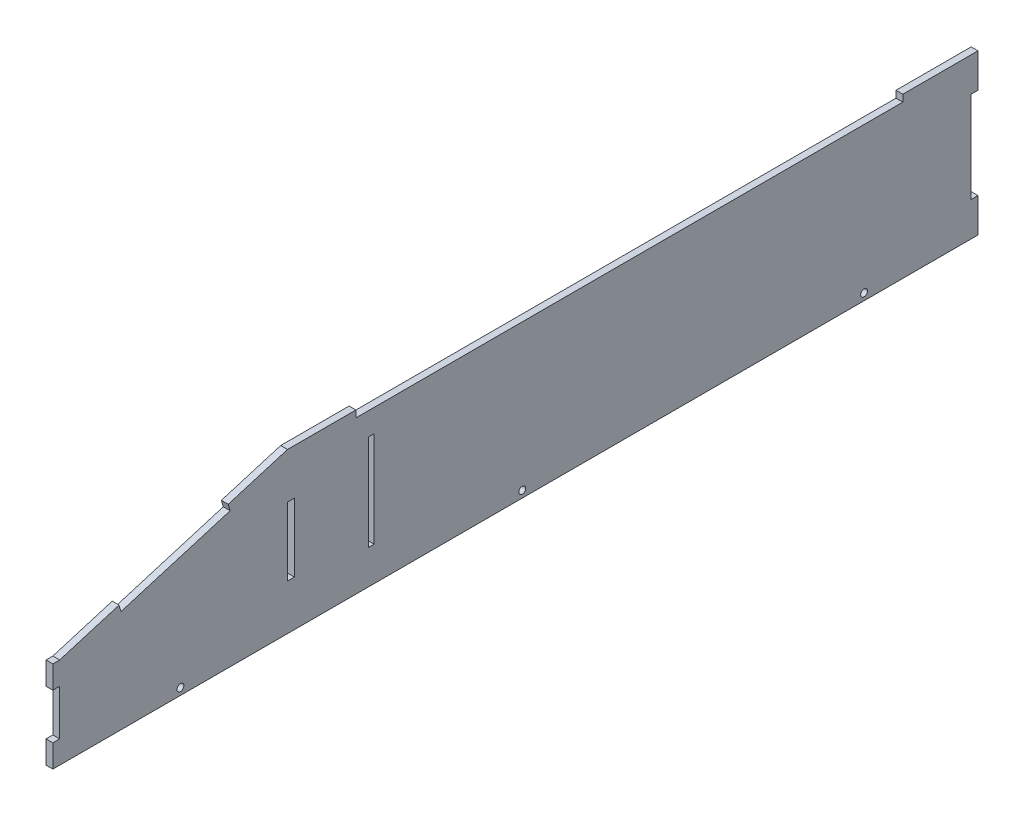
ISO-10303-21;
HEADER;
FILE_DESCRIPTION(('STEP AP214'),'2;1');
FILE_NAME('part.step','',(''),(''),'','','');
FILE_SCHEMA(('AUTOMOTIVE_DESIGN { 1 0 10303 214 1 1 1 1 }'));
ENDSEC;
DATA;
#1=APPLICATION_CONTEXT('core data for automotive mechanical design processes');
#2=APPLICATION_PROTOCOL_DEFINITION('international standard','automotive_design',2000,#1);
#3=PRODUCT_CONTEXT('',#1,'mechanical');
#4=PRODUCT('Part','Part','',(#3));
#5=PRODUCT_RELATED_PRODUCT_CATEGORY('part','',(#4));
#6=PRODUCT_DEFINITION_FORMATION('','',#4);
#7=PRODUCT_DEFINITION_CONTEXT('part definition',#1,'design');
#8=PRODUCT_DEFINITION('design','',#6,#7);
#9=PRODUCT_DEFINITION_SHAPE('','',#8);
#10=(LENGTH_UNIT() NAMED_UNIT(*) SI_UNIT(.MILLI.,.METRE.));
#11=(NAMED_UNIT(*) PLANE_ANGLE_UNIT() SI_UNIT($,.RADIAN.));
#12=(NAMED_UNIT(*) SI_UNIT($,.STERADIAN.) SOLID_ANGLE_UNIT());
#13=UNCERTAINTY_MEASURE_WITH_UNIT(LENGTH_MEASURE(1.E-05),#10,'distance_accuracy_value','');
#14=(GEOMETRIC_REPRESENTATION_CONTEXT(3) GLOBAL_UNCERTAINTY_ASSIGNED_CONTEXT((#13)) GLOBAL_UNIT_ASSIGNED_CONTEXT((#10,
#11,#12)) REPRESENTATION_CONTEXT('',''));
#15=CARTESIAN_POINT('',(0.,0.,0.));
#16=DIRECTION('',(0.,0.,1.));
#17=DIRECTION('',(1.,0.,0.));
#18=AXIS2_PLACEMENT_3D('',#15,#16,#17);
#19=CARTESIAN_POINT('',(3.,40.1738959397817,119.855679605587));
#20=DIRECTION('',(0.,0.,-1.));
#21=DIRECTION('',(-1.,0.,0.));
#22=AXIS2_PLACEMENT_3D('',#19,#20,#21);
#23=PLANE('',#22);
#24=DIRECTION('',(0.,-1.,0.));
#25=VECTOR('',#24,1.);
#26=CARTESIAN_POINT('',(3.,40.1738959397817,119.855679605587));
#27=LINE('',#26,#25);
#28=CARTESIAN_POINT('',(3.,10.1738959397816,119.855679605587));
#29=VERTEX_POINT('',#28);
#30=CARTESIAN_POINT('',(3.,0.173895939781652,119.855679605587));
#31=VERTEX_POINT('',#30);
#32=EDGE_CURVE('E418',#29,#31,#27,.T.);
#33=ORIENTED_EDGE('',*,*,#32,.F.);
#34=DIRECTION('',(-1.,0.,0.));
#35=VECTOR('',#34,1.);
#36=CARTESIAN_POINT('',(518.001516988057,10.1738959397816,119.855679605587));
#37=LINE('',#36,#35);
#38=CARTESIAN_POINT('',(0.,10.1738959397816,119.855679605587));
#39=VERTEX_POINT('',#38);
#40=EDGE_CURVE('E313',#29,#39,#37,.T.);
#41=ORIENTED_EDGE('',*,*,#40,.T.);
#42=DIRECTION('',(0.,-1.,0.));
#43=VECTOR('',#42,1.);
#44=CARTESIAN_POINT('',(0.,40.1738959397817,119.855679605587));
#45=LINE('',#44,#43);
#46=CARTESIAN_POINT('',(0.,0.173895939781652,119.855679605587));
#47=VERTEX_POINT('',#46);
#48=EDGE_CURVE('E439',#39,#47,#45,.T.);
#49=ORIENTED_EDGE('',*,*,#48,.T.);
#50=DIRECTION('',(-1.,0.,0.));
#51=VECTOR('',#50,1.);
#52=CARTESIAN_POINT('',(3.,0.173895939781652,119.855679605587));
#53=LINE('',#52,#51);
#54=EDGE_CURVE('E422',#31,#47,#53,.T.);
#55=ORIENTED_EDGE('',*,*,#54,.F.);
#56=EDGE_LOOP('',(#33,#41,#49,#55));
#57=FACE_BOUND('',#56,.T.);
#58=ADVANCED_FACE('F33',(#57),#23,.F.);
#59=CARTESIAN_POINT('',(3.,40.1738959397817,116.855679605587));
#60=DIRECTION('',(0.,-0.957826285221152,-0.287347885566345));
#61=DIRECTION('',(0.,0.287347885566345,-0.957826285221152));
#62=AXIS2_PLACEMENT_3D('',#59,#60,#61);
#63=PLANE('',#62);
#64=DIRECTION('',(0.,-0.287347885566345,0.957826285221151));
#65=VECTOR('',#64,1.);
#66=CARTESIAN_POINT('',(3.,40.1738959397817,116.855679605587));
#67=LINE('',#66,#65);
#68=CARTESIAN_POINT('',(3.,47.9906391740598,90.7998688246599));
#69=VERTEX_POINT('',#68);
#70=CARTESIAN_POINT('',(3.,40.1738959397817,116.855679605587));
#71=VERTEX_POINT('',#70);
#72=EDGE_CURVE('E412',#69,#71,#67,.T.);
#73=ORIENTED_EDGE('',*,*,#72,.F.);
#74=DIRECTION('',(-1.,0.,0.));
#75=VECTOR('',#74,1.);
#76=CARTESIAN_POINT('',(518.001516988057,47.9906391740598,90.7998688246599));
#77=LINE('',#76,#75);
#78=CARTESIAN_POINT('',(0.,47.9906391740598,90.7998688246599));
#79=VERTEX_POINT('',#78);
#80=EDGE_CURVE('E340',#69,#79,#77,.T.);
#81=ORIENTED_EDGE('',*,*,#80,.T.);
#82=DIRECTION('',(0.,-0.287347885566345,0.957826285221151));
#83=VECTOR('',#82,1.);
#84=CARTESIAN_POINT('',(0.,40.1738959397817,116.855679605587));
#85=LINE('',#84,#83);
#86=CARTESIAN_POINT('',(0.,40.1738959397817,116.855679605587));
#87=VERTEX_POINT('',#86);
#88=EDGE_CURVE('E433',#79,#87,#85,.T.);
#89=ORIENTED_EDGE('',*,*,#88,.T.);
#90=DIRECTION('',(-1.,0.,0.));
#91=VECTOR('',#90,1.);
#92=CARTESIAN_POINT('',(3.,40.1738959397817,116.855679605587));
#93=LINE('',#92,#91);
#94=EDGE_CURVE('E447',#71,#87,#93,.T.);
#95=ORIENTED_EDGE('',*,*,#94,.F.);
#96=EDGE_LOOP('',(#73,#81,#89,#95));
#97=FACE_BOUND('',#96,.T.);
#98=ADVANCED_FACE('F585',(#97),#63,.F.);
#99=CARTESIAN_POINT('',(3.,70.1738959397817,16.855679605587));
#100=DIRECTION('',(0.,-1.,0.));
#101=DIRECTION('',(0.,0.,-1.));
#102=AXIS2_PLACEMENT_3D('',#99,#100,#101);
#103=PLANE('',#102);
#104=DIRECTION('',(0.,0.,1.));
#105=VECTOR('',#104,1.);
#106=CARTESIAN_POINT('',(3.,70.1738959397817,16.855679605587));
#107=LINE('',#106,#105);
#108=CARTESIAN_POINT('',(3.,70.1738959397817,-13.144320394413));
#109=VERTEX_POINT('',#108);
#110=CARTESIAN_POINT('',(3.,70.1738959397817,16.855679605587));
#111=VERTEX_POINT('',#110);
#112=EDGE_CURVE('E408',#109,#111,#107,.T.);
#113=ORIENTED_EDGE('',*,*,#112,.F.);
#114=DIRECTION('',(-1.,0.,0.));
#115=VECTOR('',#114,1.);
#116=CARTESIAN_POINT('',(518.001516988057,70.1738959397817,-13.144320394413));
#117=LINE('',#116,#115);
#118=CARTESIAN_POINT('',(0.,70.1738959397817,-13.144320394413));
#119=VERTEX_POINT('',#118);
#120=EDGE_CURVE('E367',#109,#119,#117,.T.);
#121=ORIENTED_EDGE('',*,*,#120,.T.);
#122=DIRECTION('',(0.,0.,1.));
#123=VECTOR('',#122,1.);
#124=CARTESIAN_POINT('',(0.,70.1738959397817,16.855679605587));
#125=LINE('',#124,#123);
#126=CARTESIAN_POINT('',(0.,70.1738959397817,16.855679605587));
#127=VERTEX_POINT('',#126);
#128=EDGE_CURVE('E429',#119,#127,#125,.T.);
#129=ORIENTED_EDGE('',*,*,#128,.T.);
#130=DIRECTION('',(-1.,0.,0.));
#131=VECTOR('',#130,1.);
#132=CARTESIAN_POINT('',(3.,70.1738959397817,16.855679605587));
#133=LINE('',#132,#131);
#134=EDGE_CURVE('E450',#111,#127,#133,.T.);
#135=ORIENTED_EDGE('',*,*,#134,.F.);
#136=EDGE_LOOP('',(#113,#121,#129,#135));
#137=FACE_BOUND('',#136,.T.);
#138=ADVANCED_FACE('F567',(#137),#103,.F.);
#139=CARTESIAN_POINT('',(3.,0.173895939781676,-286.144320394413));
#140=DIRECTION('',(0.,0.,1.));
#141=DIRECTION('',(1.,0.,0.));
#142=AXIS2_PLACEMENT_3D('',#139,#140,#141);
#143=PLANE('',#142);
#144=DIRECTION('',(-1.,0.,0.));
#145=VECTOR('',#144,1.);
#146=CARTESIAN_POINT('',(521.751516988057,15.1738959397817,-286.144320394413));
#147=LINE('',#146,#145);
#148=CARTESIAN_POINT('',(3.,15.1738959397817,-286.144320394413));
#149=VERTEX_POINT('',#148);
#150=CARTESIAN_POINT('',(0.,15.1738959397817,-286.144320394413));
#151=VERTEX_POINT('',#150);
#152=EDGE_CURVE('E394',#149,#151,#147,.T.);
#153=ORIENTED_EDGE('',*,*,#152,.F.);
#154=DIRECTION('',(0.,1.,0.));
#155=VECTOR('',#154,1.);
#156=CARTESIAN_POINT('',(3.,0.173895939781676,-286.144320394413));
#157=LINE('',#156,#155);
#158=CARTESIAN_POINT('',(3.,0.173895939781676,-286.144320394413));
#159=VERTEX_POINT('',#158);
#160=EDGE_CURVE('E405',#159,#149,#157,.T.);
#161=ORIENTED_EDGE('',*,*,#160,.F.);
#162=DIRECTION('',(-1.,0.,0.));
#163=VECTOR('',#162,1.);
#164=CARTESIAN_POINT('',(3.,0.173895939781676,-286.144320394413));
#165=LINE('',#164,#163);
#166=CARTESIAN_POINT('',(0.,0.173895939781676,-286.144320394413));
#167=VERTEX_POINT('',#166);
#168=EDGE_CURVE('E456',#159,#167,#165,.T.);
#169=ORIENTED_EDGE('',*,*,#168,.T.);
#170=DIRECTION('',(0.,1.,0.));
#171=VECTOR('',#170,1.);
#172=CARTESIAN_POINT('',(0.,0.173895939781676,-286.144320394413));
#173=LINE('',#172,#171);
#174=EDGE_CURVE('E426',#167,#151,#173,.T.);
#175=ORIENTED_EDGE('',*,*,#174,.T.);
#176=EDGE_LOOP('',(#153,#161,#169,#175));
#177=FACE_BOUND('',#176,.T.);
#178=ADVANCED_FACE('F535',(#177),#143,.F.);
#179=DIRECTION('',(-1.,0.,0.));
#180=VECTOR('',#179,1.);
#181=CARTESIAN_POINT('',(521.751516988057,55.1738959397817,-286.144320394413));
#182=LINE('',#181,#180);
#183=CARTESIAN_POINT('',(3.,55.1738959397817,-286.144320394413));
#184=VERTEX_POINT('',#183);
#185=CARTESIAN_POINT('',(0.,55.1738959397817,-286.144320394413));
#186=VERTEX_POINT('',#185);
#187=EDGE_CURVE('E388',#184,#186,#182,.T.);
#188=ORIENTED_EDGE('',*,*,#187,.T.);
#189=CARTESIAN_POINT('',(0.,70.1738959397817,-286.144320394413));
#190=VERTEX_POINT('',#189);
#191=EDGE_CURVE('E425',#186,#190,#173,.T.);
#192=ORIENTED_EDGE('',*,*,#191,.T.);
#193=DIRECTION('',(-1.,0.,0.));
#194=VECTOR('',#193,1.);
#195=CARTESIAN_POINT('',(3.,70.1738959397817,-286.144320394413));
#196=LINE('',#195,#194);
#197=CARTESIAN_POINT('',(3.,70.1738959397817,-286.144320394413));
#198=VERTEX_POINT('',#197);
#199=EDGE_CURVE('E453',#198,#190,#196,.T.);
#200=ORIENTED_EDGE('',*,*,#199,.F.);
#201=EDGE_CURVE('E403',#184,#198,#157,.T.);
#202=ORIENTED_EDGE('',*,*,#201,.F.);
#203=EDGE_LOOP('',(#188,#192,#200,#202));
#204=FACE_BOUND('',#203,.T.);
#205=ADVANCED_FACE('F489',(#204),#143,.F.);
#206=CARTESIAN_POINT('',(3.,0.,0.));
#207=DIRECTION('',(1.,0.,0.));
#208=DIRECTION('',(0.,0.,-1.));
#209=AXIS2_PLACEMENT_3D('',#206,#207,#208);
#210=PLANE('',#209);
#211=CARTESIAN_POINT('',(3.,3.17389593977956,63.855679605587));
#212=DIRECTION('',(1.,0.,0.));
#213=DIRECTION('',(0.,0.,-1.));
#214=AXIS2_PLACEMENT_3D('',#211,#212,#213);
#215=CIRCLE('',#214,1.50000000000003);
#216=CARTESIAN_POINT('',(3.,3.17389593977956,62.3556796055869));
#217=VERTEX_POINT('',#216);
#218=EDGE_CURVE('E479',#217,#217,#215,.T.);
#219=ORIENTED_EDGE('',*,*,#218,.F.);
#220=EDGE_LOOP('',(#219));
#221=FACE_BOUND('',#220,.T.);
#222=CARTESIAN_POINT('',(3.,3.1738959397806,-86.144320394413));
#223=DIRECTION('',(1.,0.,0.));
#224=DIRECTION('',(0.,0.,-1.));
#225=AXIS2_PLACEMENT_3D('',#222,#223,#224);
#226=CIRCLE('',#225,1.50000000000003);
#227=CARTESIAN_POINT('',(3.,3.1738959397806,-87.6443203944131));
#228=VERTEX_POINT('',#227);
#229=EDGE_CURVE('E469',#228,#228,#226,.T.);
#230=ORIENTED_EDGE('',*,*,#229,.F.);
#231=EDGE_LOOP('',(#230));
#232=FACE_BOUND('',#231,.T.);
#233=CARTESIAN_POINT('',(3.,3.17389593978165,-236.144320394413));
#234=DIRECTION('',(1.,0.,0.));
#235=DIRECTION('',(0.,0.,-1.));
#236=AXIS2_PLACEMENT_3D('',#233,#234,#235);
#237=CIRCLE('',#236,1.50000000000003);
#238=CARTESIAN_POINT('',(3.,3.17389593978165,-237.644320394413));
#239=VERTEX_POINT('',#238);
#240=EDGE_CURVE('E466',#239,#239,#237,.T.);
#241=ORIENTED_EDGE('',*,*,#240,.F.);
#242=EDGE_LOOP('',(#241));
#243=FACE_BOUND('',#242,.T.);
#244=DIRECTION('',(0.,1.,0.));
#245=VECTOR('',#244,1.);
#246=CARTESIAN_POINT('',(3.,57.1738959397817,-21.144320394413));
#247=LINE('',#246,#245);
#248=CARTESIAN_POINT('',(3.,15.1738959397817,-21.144320394413));
#249=VERTEX_POINT('',#248);
#250=CARTESIAN_POINT('',(3.,57.1738959397817,-21.144320394413));
#251=VERTEX_POINT('',#250);
#252=EDGE_CURVE('E50',#249,#251,#247,.T.);
#253=ORIENTED_EDGE('',*,*,#252,.F.);
#254=DIRECTION('',(0.,0.,-1.));
#255=VECTOR('',#254,1.);
#256=CARTESIAN_POINT('',(3.,15.1738959397817,-21.144320394413));
#257=LINE('',#256,#255);
#258=CARTESIAN_POINT('',(3.,15.1738959397817,-18.644320394413));
#259=VERTEX_POINT('',#258);
#260=EDGE_CURVE('E251',#259,#249,#257,.T.);
#261=ORIENTED_EDGE('',*,*,#260,.F.);
#262=DIRECTION('',(0.,-1.,0.));
#263=VECTOR('',#262,1.);
#264=CARTESIAN_POINT('',(3.,57.1738959397817,-18.644320394413));
#265=LINE('',#264,#263);
#266=CARTESIAN_POINT('',(3.,57.1738959397817,-18.644320394413));
#267=VERTEX_POINT('',#266);
#268=EDGE_CURVE('E235',#267,#259,#265,.T.);
#269=ORIENTED_EDGE('',*,*,#268,.F.);
#270=DIRECTION('',(0.,0.,1.));
#271=VECTOR('',#270,1.);
#272=CARTESIAN_POINT('',(3.,57.1738959397817,-21.144320394413));
#273=LINE('',#272,#271);
#274=EDGE_CURVE('E244',#251,#267,#273,.T.);
#275=ORIENTED_EDGE('',*,*,#274,.F.);
#276=EDGE_LOOP('',(#253,#261,#269,#275));
#277=FACE_BOUND('',#276,.T.);
#278=DIRECTION('',(0.,0.,1.));
#279=VECTOR('',#278,1.);
#280=CARTESIAN_POINT('',(3.,50.1738959397817,13.855679605587));
#281=LINE('',#280,#279);
#282=CARTESIAN_POINT('',(3.,50.1738959397817,13.855679605587));
#283=VERTEX_POINT('',#282);
#284=CARTESIAN_POINT('',(3.,50.1738959397817,16.855679605587));
#285=VERTEX_POINT('',#284);
#286=EDGE_CURVE('E258',#283,#285,#281,.T.);
#287=ORIENTED_EDGE('',*,*,#286,.F.);
#288=DIRECTION('',(0.,1.,0.));
#289=VECTOR('',#288,1.);
#290=CARTESIAN_POINT('',(3.,20.1738959397817,13.855679605587));
#291=LINE('',#290,#289);
#292=CARTESIAN_POINT('',(3.,20.1738959397817,13.855679605587));
#293=VERTEX_POINT('',#292);
#294=EDGE_CURVE('E265',#293,#283,#291,.T.);
#295=ORIENTED_EDGE('',*,*,#294,.F.);
#296=DIRECTION('',(0.,0.,-1.));
#297=VECTOR('',#296,1.);
#298=CARTESIAN_POINT('',(3.,20.1738959397817,16.855679605587));
#299=LINE('',#298,#297);
#300=CARTESIAN_POINT('',(3.,20.1738959397817,16.855679605587));
#301=VERTEX_POINT('',#300);
#302=EDGE_CURVE('E279',#301,#293,#299,.T.);
#303=ORIENTED_EDGE('',*,*,#302,.F.);
#304=DIRECTION('',(0.,-1.,0.));
#305=VECTOR('',#304,1.);
#306=CARTESIAN_POINT('',(3.,50.1738959397817,16.855679605587));
#307=LINE('',#306,#305);
#308=EDGE_CURVE('E276',#285,#301,#307,.T.);
#309=ORIENTED_EDGE('',*,*,#308,.F.);
#310=EDGE_LOOP('',(#287,#295,#303,#309));
#311=FACE_BOUND('',#310,.T.);
#312=DIRECTION('',(0.,0.,1.));
#313=VECTOR('',#312,1.);
#314=CARTESIAN_POINT('',(3.,10.1738959397816,116.855679605587));
#315=LINE('',#314,#313);
#316=CARTESIAN_POINT('',(3.,10.1738959397816,116.855679605587));
#317=VERTEX_POINT('',#316);
#318=EDGE_CURVE('E296',#317,#29,#315,.T.);
#319=ORIENTED_EDGE('',*,*,#318,.T.);
#320=ORIENTED_EDGE('',*,*,#32,.T.);
#321=DIRECTION('',(0.,0.,-1.));
#322=VECTOR('',#321,1.);
#323=CARTESIAN_POINT('',(3.,0.173895939781652,119.855679605587));
#324=LINE('',#323,#322);
#325=EDGE_CURVE('E400',#31,#159,#324,.T.);
#326=ORIENTED_EDGE('',*,*,#325,.T.);
#327=ORIENTED_EDGE('',*,*,#160,.T.);
#328=DIRECTION('',(0.,0.,-1.));
#329=VECTOR('',#328,1.);
#330=CARTESIAN_POINT('',(3.,15.1738959397817,-283.144320394413));
#331=LINE('',#330,#329);
#332=CARTESIAN_POINT('',(3.,15.1738959397817,-283.144320394413));
#333=VERTEX_POINT('',#332);
#334=EDGE_CURVE('E377',#333,#149,#331,.T.);
#335=ORIENTED_EDGE('',*,*,#334,.F.);
#336=DIRECTION('',(0.,-1.,0.));
#337=VECTOR('',#336,1.);
#338=CARTESIAN_POINT('',(3.,55.1738959397817,-283.144320394413));
#339=LINE('',#338,#337);
#340=CARTESIAN_POINT('',(3.,55.1738959397817,-283.144320394413));
#341=VERTEX_POINT('',#340);
#342=EDGE_CURVE('E374',#341,#333,#339,.T.);
#343=ORIENTED_EDGE('',*,*,#342,.F.);
#344=DIRECTION('',(0.,0.,1.));
#345=VECTOR('',#344,1.);
#346=CARTESIAN_POINT('',(3.,55.1738959397817,-286.144320394413));
#347=LINE('',#346,#345);
#348=EDGE_CURVE('E376',#184,#341,#347,.T.);
#349=ORIENTED_EDGE('',*,*,#348,.F.);
#350=ORIENTED_EDGE('',*,*,#201,.T.);
#351=CARTESIAN_POINT('',(3.,70.1738959397817,-253.144320394413));
#352=VERTEX_POINT('',#351);
#353=EDGE_CURVE('E409',#198,#352,#107,.T.);
#354=ORIENTED_EDGE('',*,*,#353,.T.);
#355=DIRECTION('',(0.,-1.,0.));
#356=VECTOR('',#355,1.);
#357=CARTESIAN_POINT('',(3.,70.1738959397817,-253.144320394413));
#358=LINE('',#357,#356);
#359=CARTESIAN_POINT('',(3.,67.1738959397817,-253.144320394413));
#360=VERTEX_POINT('',#359);
#361=EDGE_CURVE('E349',#352,#360,#358,.T.);
#362=ORIENTED_EDGE('',*,*,#361,.T.);
#363=DIRECTION('',(0.,0.,1.));
#364=VECTOR('',#363,1.);
#365=CARTESIAN_POINT('',(3.,67.1738959397817,-253.144320394413));
#366=LINE('',#365,#364);
#367=CARTESIAN_POINT('',(3.,67.1738959397817,-13.144320394413));
#368=VERTEX_POINT('',#367);
#369=EDGE_CURVE('E347',#360,#368,#366,.T.);
#370=ORIENTED_EDGE('',*,*,#369,.T.);
#371=DIRECTION('',(0.,1.,0.));
#372=VECTOR('',#371,1.);
#373=CARTESIAN_POINT('',(3.,67.1738959397817,-13.144320394413));
#374=LINE('',#373,#372);
#375=EDGE_CURVE('E350',#368,#109,#374,.T.);
#376=ORIENTED_EDGE('',*,*,#375,.T.);
#377=ORIENTED_EDGE('',*,*,#112,.T.);
#378=CARTESIAN_POINT('',(3.,62.3580334523771,42.9085545636023));
#379=VERTEX_POINT('',#378);
#380=EDGE_CURVE('E413',#111,#379,#67,.T.);
#381=ORIENTED_EDGE('',*,*,#380,.T.);
#382=DIRECTION('',(0.,-0.957826285221151,-0.287347885566347));
#383=VECTOR('',#382,1.);
#384=CARTESIAN_POINT('',(3.,62.3580334523771,42.9085545636023));
#385=LINE('',#384,#383);
#386=CARTESIAN_POINT('',(3.,59.4845545967136,42.0465109069033));
#387=VERTEX_POINT('',#386);
#388=EDGE_CURVE('E322',#379,#387,#385,.T.);
#389=ORIENTED_EDGE('',*,*,#388,.T.);
#390=DIRECTION('',(0.,-0.287347885566347,0.957826285221151));
#391=VECTOR('',#390,1.);
#392=CARTESIAN_POINT('',(3.,59.4845545967136,42.0465109069033));
#393=LINE('',#392,#391);
#394=CARTESIAN_POINT('',(3.,45.1171603183962,89.9378251679608));
#395=VERTEX_POINT('',#394);
#396=EDGE_CURVE('E320',#387,#395,#393,.T.);
#397=ORIENTED_EDGE('',*,*,#396,.T.);
#398=DIRECTION('',(0.,0.957826285221151,0.287347885566349));
#399=VECTOR('',#398,1.);
#400=CARTESIAN_POINT('',(3.,45.1171603183963,89.9378251679608));
#401=LINE('',#400,#399);
#402=EDGE_CURVE('E323',#395,#69,#401,.T.);
#403=ORIENTED_EDGE('',*,*,#402,.T.);
#404=ORIENTED_EDGE('',*,*,#72,.T.);
#405=DIRECTION('',(0.,0.,1.));
#406=VECTOR('',#405,1.);
#407=CARTESIAN_POINT('',(3.,40.1738959397817,119.855679605587));
#408=LINE('',#407,#406);
#409=CARTESIAN_POINT('',(3.,40.1738959397817,119.855679605587));
#410=VERTEX_POINT('',#409);
#411=EDGE_CURVE('E416',#71,#410,#408,.T.);
#412=ORIENTED_EDGE('',*,*,#411,.T.);
#413=CARTESIAN_POINT('',(3.,30.1738959397816,119.855679605587));
#414=VERTEX_POINT('',#413);
#415=EDGE_CURVE('E419',#410,#414,#27,.T.);
#416=ORIENTED_EDGE('',*,*,#415,.T.);
#417=DIRECTION('',(0.,0.,-1.));
#418=VECTOR('',#417,1.);
#419=CARTESIAN_POINT('',(3.,30.1738959397816,119.855679605587));
#420=LINE('',#419,#418);
#421=CARTESIAN_POINT('',(3.,30.1738959397817,116.855679605587));
#422=VERTEX_POINT('',#421);
#423=EDGE_CURVE('E295',#414,#422,#420,.T.);
#424=ORIENTED_EDGE('',*,*,#423,.T.);
#425=DIRECTION('',(0.,-1.,0.));
#426=VECTOR('',#425,1.);
#427=CARTESIAN_POINT('',(3.,30.1738959397817,116.855679605587));
#428=LINE('',#427,#426);
#429=EDGE_CURVE('E293',#422,#317,#428,.T.);
#430=ORIENTED_EDGE('',*,*,#429,.T.);
#431=EDGE_LOOP('',(#319,#320,#326,#327,#335,#343,#349,#350,#354,#362,#370,#376,#377,#381,#389,
#397,#403,#404,#412,#416,#424,#430));
#432=FACE_BOUND('',#431,.T.);
#433=ADVANCED_FACE('F248',(#221,#232,#243,#277,#311,#432),#210,.T.);
#434=CARTESIAN_POINT('',(3.,0.173895939781652,119.855679605587));
#435=DIRECTION('',(0.,1.,0.));
#436=DIRECTION('',(0.,0.,1.));
#437=AXIS2_PLACEMENT_3D('',#434,#435,#436);
#438=PLANE('',#437);
#439=DIRECTION('',(0.,0.,-1.));
#440=VECTOR('',#439,1.);
#441=CARTESIAN_POINT('',(0.,0.173895939781652,119.855679605587));
#442=LINE('',#441,#440);
#443=EDGE_CURVE('E379',#47,#167,#442,.T.);
#444=ORIENTED_EDGE('',*,*,#443,.T.);
#445=ORIENTED_EDGE('',*,*,#168,.F.);
#446=ORIENTED_EDGE('',*,*,#325,.F.);
#447=ORIENTED_EDGE('',*,*,#54,.T.);
#448=EDGE_LOOP('',(#444,#445,#446,#447));
#449=FACE_BOUND('',#448,.T.);
#450=ADVANCED_FACE('F35',(#449),#438,.F.);
#451=CARTESIAN_POINT('',(0.,70.1738959397817,-253.144320394413));
#452=VERTEX_POINT('',#451);
#453=EDGE_CURVE('E430',#190,#452,#125,.T.);
#454=ORIENTED_EDGE('',*,*,#453,.T.);
#455=DIRECTION('',(-1.,0.,0.));
#456=VECTOR('',#455,1.);
#457=CARTESIAN_POINT('',(518.001516988057,70.1738959397817,-253.144320394413));
#458=LINE('',#457,#456);
#459=EDGE_CURVE('E361',#352,#452,#458,.T.);
#460=ORIENTED_EDGE('',*,*,#459,.F.);
#461=ORIENTED_EDGE('',*,*,#353,.F.);
#462=ORIENTED_EDGE('',*,*,#199,.T.);
#463=EDGE_LOOP('',(#454,#460,#461,#462));
#464=FACE_BOUND('',#463,.T.);
#465=ADVANCED_FACE('F552',(#464),#103,.F.);
#466=CARTESIAN_POINT('',(0.,62.3580334523771,42.9085545636023));
#467=VERTEX_POINT('',#466);
#468=EDGE_CURVE('E434',#127,#467,#85,.T.);
#469=ORIENTED_EDGE('',*,*,#468,.T.);
#470=DIRECTION('',(-1.,0.,0.));
#471=VECTOR('',#470,1.);
#472=CARTESIAN_POINT('',(518.001516988057,62.3580334523771,42.9085545636023));
#473=LINE('',#472,#471);
#474=EDGE_CURVE('E334',#379,#467,#473,.T.);
#475=ORIENTED_EDGE('',*,*,#474,.F.);
#476=ORIENTED_EDGE('',*,*,#380,.F.);
#477=ORIENTED_EDGE('',*,*,#134,.T.);
#478=EDGE_LOOP('',(#469,#475,#476,#477));
#479=FACE_BOUND('',#478,.T.);
#480=ADVANCED_FACE('F595',(#479),#63,.F.);
#481=CARTESIAN_POINT('',(3.,40.1738959397817,119.855679605587));
#482=DIRECTION('',(0.,-1.,0.));
#483=DIRECTION('',(0.,0.,-1.));
#484=AXIS2_PLACEMENT_3D('',#481,#482,#483);
#485=PLANE('',#484);
#486=DIRECTION('',(0.,0.,1.));
#487=VECTOR('',#486,1.);
#488=CARTESIAN_POINT('',(0.,40.1738959397817,119.855679605587));
#489=LINE('',#488,#487);
#490=CARTESIAN_POINT('',(0.,40.1738959397817,119.855679605587));
#491=VERTEX_POINT('',#490);
#492=EDGE_CURVE('E437',#87,#491,#489,.T.);
#493=ORIENTED_EDGE('',*,*,#492,.T.);
#494=DIRECTION('',(-1.,0.,0.));
#495=VECTOR('',#494,1.);
#496=CARTESIAN_POINT('',(3.,40.1738959397817,119.855679605587));
#497=LINE('',#496,#495);
#498=EDGE_CURVE('E444',#410,#491,#497,.T.);
#499=ORIENTED_EDGE('',*,*,#498,.F.);
#500=ORIENTED_EDGE('',*,*,#411,.F.);
#501=ORIENTED_EDGE('',*,*,#94,.T.);
#502=EDGE_LOOP('',(#493,#499,#500,#501));
#503=FACE_BOUND('',#502,.T.);
#504=ADVANCED_FACE('F591',(#503),#485,.F.);
#505=CARTESIAN_POINT('',(0.,30.1738959397816,119.855679605587));
#506=VERTEX_POINT('',#505);
#507=EDGE_CURVE('E404',#491,#506,#45,.T.);
#508=ORIENTED_EDGE('',*,*,#507,.T.);
#509=DIRECTION('',(-1.,0.,0.));
#510=VECTOR('',#509,1.);
#511=CARTESIAN_POINT('',(518.001516988057,30.1738959397816,119.855679605587));
#512=LINE('',#511,#510);
#513=EDGE_CURVE('E307',#414,#506,#512,.T.);
#514=ORIENTED_EDGE('',*,*,#513,.F.);
#515=ORIENTED_EDGE('',*,*,#415,.F.);
#516=ORIENTED_EDGE('',*,*,#498,.T.);
#517=EDGE_LOOP('',(#508,#514,#515,#516));
#518=FACE_BOUND('',#517,.T.);
#519=ADVANCED_FACE('F505',(#518),#23,.F.);
#520=CARTESIAN_POINT('',(0.,0.,0.));
#521=DIRECTION('',(1.,0.,0.));
#522=DIRECTION('',(0.,0.,-1.));
#523=AXIS2_PLACEMENT_3D('',#520,#521,#522);
#524=PLANE('',#523);
#525=CARTESIAN_POINT('',(0.,3.17389593977956,63.855679605587));
#526=DIRECTION('',(1.,0.,0.));
#527=DIRECTION('',(0.,0.,-1.));
#528=AXIS2_PLACEMENT_3D('',#525,#526,#527);
#529=CIRCLE('',#528,1.50000000000003);
#530=CARTESIAN_POINT('',(0.,3.17389593977956,62.3556796055869));
#531=VERTEX_POINT('',#530);
#532=EDGE_CURVE('E37',#531,#531,#529,.T.);
#533=ORIENTED_EDGE('',*,*,#532,.T.);
#534=EDGE_LOOP('',(#533));
#535=FACE_BOUND('',#534,.T.);
#536=CARTESIAN_POINT('',(0.,3.1738959397806,-86.144320394413));
#537=DIRECTION('',(1.,0.,0.));
#538=DIRECTION('',(0.,0.,-1.));
#539=AXIS2_PLACEMENT_3D('',#536,#537,#538);
#540=CIRCLE('',#539,1.50000000000003);
#541=CARTESIAN_POINT('',(0.,3.1738959397806,-87.6443203944131));
#542=VERTEX_POINT('',#541);
#543=EDGE_CURVE('E467',#542,#542,#540,.T.);
#544=ORIENTED_EDGE('',*,*,#543,.T.);
#545=EDGE_LOOP('',(#544));
#546=FACE_BOUND('',#545,.T.);
#547=CARTESIAN_POINT('',(0.,3.17389593978165,-236.144320394413));
#548=DIRECTION('',(1.,0.,0.));
#549=DIRECTION('',(0.,0.,-1.));
#550=AXIS2_PLACEMENT_3D('',#547,#548,#549);
#551=CIRCLE('',#550,1.50000000000003);
#552=CARTESIAN_POINT('',(0.,3.17389593978165,-237.644320394413));
#553=VERTEX_POINT('',#552);
#554=EDGE_CURVE('E464',#553,#553,#551,.T.);
#555=ORIENTED_EDGE('',*,*,#554,.T.);
#556=EDGE_LOOP('',(#555));
#557=FACE_BOUND('',#556,.T.);
#558=DIRECTION('',(0.,0.,-1.));
#559=VECTOR('',#558,1.);
#560=CARTESIAN_POINT('',(0.,15.1738959397817,0.));
#561=LINE('',#560,#559);
#562=CARTESIAN_POINT('',(0.,15.1738959397817,-18.644320394413));
#563=VERTEX_POINT('',#562);
#564=CARTESIAN_POINT('',(0.,15.1738959397817,-21.144320394413));
#565=VERTEX_POINT('',#564);
#566=EDGE_CURVE('E42',#563,#565,#561,.T.);
#567=ORIENTED_EDGE('',*,*,#566,.T.);
#568=DIRECTION('',(0.,1.,0.));
#569=VECTOR('',#568,1.);
#570=CARTESIAN_POINT('',(0.,0.,-21.144320394413));
#571=LINE('',#570,#569);
#572=CARTESIAN_POINT('',(0.,57.1738959397817,-21.144320394413));
#573=VERTEX_POINT('',#572);
#574=EDGE_CURVE('E11',#565,#573,#571,.T.);
#575=ORIENTED_EDGE('',*,*,#574,.T.);
#576=DIRECTION('',(0.,0.,1.));
#577=VECTOR('',#576,1.);
#578=CARTESIAN_POINT('',(0.,57.1738959397817,0.));
#579=LINE('',#578,#577);
#580=CARTESIAN_POINT('',(0.,57.1738959397817,-18.644320394413));
#581=VERTEX_POINT('',#580);
#582=EDGE_CURVE('E459',#573,#581,#579,.T.);
#583=ORIENTED_EDGE('',*,*,#582,.T.);
#584=DIRECTION('',(0.,-1.,0.));
#585=VECTOR('',#584,1.);
#586=CARTESIAN_POINT('',(0.,0.,-18.644320394413));
#587=LINE('',#586,#585);
#588=EDGE_CURVE('E238',#581,#563,#587,.T.);
#589=ORIENTED_EDGE('',*,*,#588,.T.);
#590=EDGE_LOOP('',(#567,#575,#583,#589));
#591=FACE_BOUND('',#590,.T.);
#592=DIRECTION('',(0.,1.,0.));
#593=VECTOR('',#592,1.);
#594=CARTESIAN_POINT('',(0.,20.1738959397817,13.855679605587));
#595=LINE('',#594,#593);
#596=CARTESIAN_POINT('',(0.,20.1738959397817,13.855679605587));
#597=VERTEX_POINT('',#596);
#598=CARTESIAN_POINT('',(0.,50.1738959397817,13.855679605587));
#599=VERTEX_POINT('',#598);
#600=EDGE_CURVE('E271',#597,#599,#595,.T.);
#601=ORIENTED_EDGE('',*,*,#600,.T.);
#602=DIRECTION('',(0.,0.,1.));
#603=VECTOR('',#602,1.);
#604=CARTESIAN_POINT('',(0.,50.1738959397817,13.855679605587));
#605=LINE('',#604,#603);
#606=CARTESIAN_POINT('',(0.,50.1738959397817,16.855679605587));
#607=VERTEX_POINT('',#606);
#608=EDGE_CURVE('E261',#599,#607,#605,.T.);
#609=ORIENTED_EDGE('',*,*,#608,.T.);
#610=DIRECTION('',(0.,-1.,0.));
#611=VECTOR('',#610,1.);
#612=CARTESIAN_POINT('',(0.,50.1738959397817,16.855679605587));
#613=LINE('',#612,#611);
#614=CARTESIAN_POINT('',(0.,20.1738959397817,16.855679605587));
#615=VERTEX_POINT('',#614);
#616=EDGE_CURVE('E264',#607,#615,#613,.T.);
#617=ORIENTED_EDGE('',*,*,#616,.T.);
#618=DIRECTION('',(0.,0.,-1.));
#619=VECTOR('',#618,1.);
#620=CARTESIAN_POINT('',(0.,20.1738959397817,16.855679605587));
#621=LINE('',#620,#619);
#622=EDGE_CURVE('E268',#615,#597,#621,.T.);
#623=ORIENTED_EDGE('',*,*,#622,.T.);
#624=EDGE_LOOP('',(#601,#609,#617,#623));
#625=FACE_BOUND('',#624,.T.);
#626=DIRECTION('',(0.,-1.,0.));
#627=VECTOR('',#626,1.);
#628=CARTESIAN_POINT('',(0.,30.1738959397817,116.855679605587));
#629=LINE('',#628,#627);
#630=CARTESIAN_POINT('',(0.,30.1738959397817,116.855679605587));
#631=VERTEX_POINT('',#630);
#632=CARTESIAN_POINT('',(0.,10.1738959397816,116.855679605587));
#633=VERTEX_POINT('',#632);
#634=EDGE_CURVE('E301',#631,#633,#629,.T.);
#635=ORIENTED_EDGE('',*,*,#634,.F.);
#636=DIRECTION('',(0.,0.,-1.));
#637=VECTOR('',#636,1.);
#638=CARTESIAN_POINT('',(0.,30.1738959397816,119.855679605587));
#639=LINE('',#638,#637);
#640=EDGE_CURVE('E286',#506,#631,#639,.T.);
#641=ORIENTED_EDGE('',*,*,#640,.F.);
#642=ORIENTED_EDGE('',*,*,#507,.F.);
#643=ORIENTED_EDGE('',*,*,#492,.F.);
#644=ORIENTED_EDGE('',*,*,#88,.F.);
#645=DIRECTION('',(0.,0.957826285221151,0.287347885566349));
#646=VECTOR('',#645,1.);
#647=CARTESIAN_POINT('',(0.,45.1171603183963,89.9378251679608));
#648=LINE('',#647,#646);
#649=CARTESIAN_POINT('',(0.,45.1171603183963,89.9378251679608));
#650=VERTEX_POINT('',#649);
#651=EDGE_CURVE('E331',#650,#79,#648,.T.);
#652=ORIENTED_EDGE('',*,*,#651,.F.);
#653=DIRECTION('',(0.,-0.287347885566347,0.957826285221151));
#654=VECTOR('',#653,1.);
#655=CARTESIAN_POINT('',(0.,59.4845545967136,42.0465109069033));
#656=LINE('',#655,#654);
#657=CARTESIAN_POINT('',(0.,59.4845545967136,42.0465109069033));
#658=VERTEX_POINT('',#657);
#659=EDGE_CURVE('E328',#658,#650,#656,.T.);
#660=ORIENTED_EDGE('',*,*,#659,.F.);
#661=DIRECTION('',(0.,-0.957826285221151,-0.287347885566347));
#662=VECTOR('',#661,1.);
#663=CARTESIAN_POINT('',(0.,62.3580334523771,42.9085545636023));
#664=LINE('',#663,#662);
#665=EDGE_CURVE('E298',#467,#658,#664,.T.);
#666=ORIENTED_EDGE('',*,*,#665,.F.);
#667=ORIENTED_EDGE('',*,*,#468,.F.);
#668=ORIENTED_EDGE('',*,*,#128,.F.);
#669=DIRECTION('',(0.,1.,0.));
#670=VECTOR('',#669,1.);
#671=CARTESIAN_POINT('',(0.,67.1738959397817,-13.144320394413));
#672=LINE('',#671,#670);
#673=CARTESIAN_POINT('',(0.,67.1738959397817,-13.144320394413));
#674=VERTEX_POINT('',#673);
#675=EDGE_CURVE('E358',#674,#119,#672,.T.);
#676=ORIENTED_EDGE('',*,*,#675,.F.);
#677=DIRECTION('',(0.,0.,1.));
#678=VECTOR('',#677,1.);
#679=CARTESIAN_POINT('',(0.,67.1738959397817,-253.144320394413));
#680=LINE('',#679,#678);
#681=CARTESIAN_POINT('',(0.,67.1738959397817,-253.144320394413));
#682=VERTEX_POINT('',#681);
#683=EDGE_CURVE('E355',#682,#674,#680,.T.);
#684=ORIENTED_EDGE('',*,*,#683,.F.);
#685=DIRECTION('',(0.,-1.,0.));
#686=VECTOR('',#685,1.);
#687=CARTESIAN_POINT('',(0.,70.1738959397817,-253.144320394413));
#688=LINE('',#687,#686);
#689=EDGE_CURVE('E325',#452,#682,#688,.T.);
#690=ORIENTED_EDGE('',*,*,#689,.F.);
#691=ORIENTED_EDGE('',*,*,#453,.F.);
#692=ORIENTED_EDGE('',*,*,#191,.F.);
#693=DIRECTION('',(0.,0.,1.));
#694=VECTOR('',#693,1.);
#695=CARTESIAN_POINT('',(0.,55.1738959397817,-286.144320394413));
#696=LINE('',#695,#694);
#697=CARTESIAN_POINT('',(0.,55.1738959397817,-283.144320394413));
#698=VERTEX_POINT('',#697);
#699=EDGE_CURVE('E352',#186,#698,#696,.T.);
#700=ORIENTED_EDGE('',*,*,#699,.T.);
#701=DIRECTION('',(0.,-1.,0.));
#702=VECTOR('',#701,1.);
#703=CARTESIAN_POINT('',(0.,55.1738959397817,-283.144320394413));
#704=LINE('',#703,#702);
#705=CARTESIAN_POINT('',(0.,15.1738959397817,-283.144320394413));
#706=VERTEX_POINT('',#705);
#707=EDGE_CURVE('E382',#698,#706,#704,.T.);
#708=ORIENTED_EDGE('',*,*,#707,.T.);
#709=DIRECTION('',(0.,0.,-1.));
#710=VECTOR('',#709,1.);
#711=CARTESIAN_POINT('',(0.,15.1738959397817,-283.144320394413));
#712=LINE('',#711,#710);
#713=EDGE_CURVE('E385',#706,#151,#712,.T.);
#714=ORIENTED_EDGE('',*,*,#713,.T.);
#715=ORIENTED_EDGE('',*,*,#174,.F.);
#716=ORIENTED_EDGE('',*,*,#443,.F.);
#717=ORIENTED_EDGE('',*,*,#48,.F.);
#718=DIRECTION('',(0.,0.,1.));
#719=VECTOR('',#718,1.);
#720=CARTESIAN_POINT('',(0.,10.1738959397816,116.855679605587));
#721=LINE('',#720,#719);
#722=EDGE_CURVE('E304',#633,#39,#721,.T.);
#723=ORIENTED_EDGE('',*,*,#722,.F.);
#724=EDGE_LOOP('',(#635,#641,#642,#643,#644,#652,#660,#666,#667,#668,#676,#684,#690,#691,#692,
#700,#708,#714,#715,#716,#717,#723));
#725=FACE_BOUND('',#724,.T.);
#726=ADVANCED_FACE('F501',(#535,#546,#557,#591,#625,#725),#524,.F.);
#727=CARTESIAN_POINT('',(521.751516988057,15.1738959397817,-283.144320394413));
#728=DIRECTION('',(0.,1.,0.));
#729=DIRECTION('',(0.,0.,1.));
#730=AXIS2_PLACEMENT_3D('',#727,#728,#729);
#731=PLANE('',#730);
#732=DIRECTION('',(-1.,0.,0.));
#733=VECTOR('',#732,1.);
#734=CARTESIAN_POINT('',(521.751516988057,15.1738959397817,-283.144320394413));
#735=LINE('',#734,#733);
#736=EDGE_CURVE('E396',#333,#706,#735,.T.);
#737=ORIENTED_EDGE('',*,*,#736,.F.);
#738=ORIENTED_EDGE('',*,*,#334,.T.);
#739=ORIENTED_EDGE('',*,*,#152,.T.);
#740=ORIENTED_EDGE('',*,*,#713,.F.);
#741=EDGE_LOOP('',(#737,#738,#739,#740));
#742=FACE_BOUND('',#741,.T.);
#743=ADVANCED_FACE('F504',(#742),#731,.T.);
#744=CARTESIAN_POINT('',(521.751516988057,55.1738959397817,-283.144320394413));
#745=DIRECTION('',(0.,0.,-1.));
#746=DIRECTION('',(-1.,0.,0.));
#747=AXIS2_PLACEMENT_3D('',#744,#745,#746);
#748=PLANE('',#747);
#749=DIRECTION('',(-1.,0.,0.));
#750=VECTOR('',#749,1.);
#751=CARTESIAN_POINT('',(521.751516988057,55.1738959397817,-283.144320394413));
#752=LINE('',#751,#750);
#753=EDGE_CURVE('E391',#341,#698,#752,.T.);
#754=ORIENTED_EDGE('',*,*,#753,.F.);
#755=ORIENTED_EDGE('',*,*,#342,.T.);
#756=ORIENTED_EDGE('',*,*,#736,.T.);
#757=ORIENTED_EDGE('',*,*,#707,.F.);
#758=EDGE_LOOP('',(#754,#755,#756,#757));
#759=FACE_BOUND('',#758,.T.);
#760=ADVANCED_FACE('F541',(#759),#748,.T.);
#761=CARTESIAN_POINT('',(521.751516988057,55.1738959397817,-286.144320394413));
#762=DIRECTION('',(0.,-1.,0.));
#763=DIRECTION('',(0.,0.,-1.));
#764=AXIS2_PLACEMENT_3D('',#761,#762,#763);
#765=PLANE('',#764);
#766=ORIENTED_EDGE('',*,*,#187,.F.);
#767=ORIENTED_EDGE('',*,*,#348,.T.);
#768=ORIENTED_EDGE('',*,*,#753,.T.);
#769=ORIENTED_EDGE('',*,*,#699,.F.);
#770=EDGE_LOOP('',(#766,#767,#768,#769));
#771=FACE_BOUND('',#770,.T.);
#772=ADVANCED_FACE('F544',(#771),#765,.T.);
#773=CARTESIAN_POINT('',(518.001516988057,67.1738959397817,-13.144320394413));
#774=DIRECTION('',(0.,0.,1.));
#775=DIRECTION('',(1.,0.,0.));
#776=AXIS2_PLACEMENT_3D('',#773,#774,#775);
#777=PLANE('',#776);
#778=DIRECTION('',(-1.,0.,0.));
#779=VECTOR('',#778,1.);
#780=CARTESIAN_POINT('',(518.001516988057,67.1738959397817,-13.144320394413));
#781=LINE('',#780,#779);
#782=EDGE_CURVE('E370',#368,#674,#781,.T.);
#783=ORIENTED_EDGE('',*,*,#782,.T.);
#784=ORIENTED_EDGE('',*,*,#675,.T.);
#785=ORIENTED_EDGE('',*,*,#120,.F.);
#786=ORIENTED_EDGE('',*,*,#375,.F.);
#787=EDGE_LOOP('',(#783,#784,#785,#786));
#788=FACE_BOUND('',#787,.T.);
#789=ADVANCED_FACE('F565',(#788),#777,.F.);
#790=CARTESIAN_POINT('',(518.001516988057,67.1738959397817,-253.144320394413));
#791=DIRECTION('',(0.,-1.,0.));
#792=DIRECTION('',(0.,0.,-1.));
#793=AXIS2_PLACEMENT_3D('',#790,#791,#792);
#794=PLANE('',#793);
#795=DIRECTION('',(-1.,0.,0.));
#796=VECTOR('',#795,1.);
#797=CARTESIAN_POINT('',(518.001516988057,67.1738959397817,-253.144320394413));
#798=LINE('',#797,#796);
#799=EDGE_CURVE('E364',#360,#682,#798,.T.);
#800=ORIENTED_EDGE('',*,*,#799,.T.);
#801=ORIENTED_EDGE('',*,*,#683,.T.);
#802=ORIENTED_EDGE('',*,*,#782,.F.);
#803=ORIENTED_EDGE('',*,*,#369,.F.);
#804=EDGE_LOOP('',(#800,#801,#802,#803));
#805=FACE_BOUND('',#804,.T.);
#806=ADVANCED_FACE('F559',(#805),#794,.F.);
#807=CARTESIAN_POINT('',(518.001516988057,70.1738959397817,-253.144320394413));
#808=DIRECTION('',(0.,0.,-1.));
#809=DIRECTION('',(-1.,0.,0.));
#810=AXIS2_PLACEMENT_3D('',#807,#808,#809);
#811=PLANE('',#810);
#812=ORIENTED_EDGE('',*,*,#459,.T.);
#813=ORIENTED_EDGE('',*,*,#689,.T.);
#814=ORIENTED_EDGE('',*,*,#799,.F.);
#815=ORIENTED_EDGE('',*,*,#361,.F.);
#816=EDGE_LOOP('',(#812,#813,#814,#815));
#817=FACE_BOUND('',#816,.T.);
#818=ADVANCED_FACE('F557',(#817),#811,.F.);
#819=CARTESIAN_POINT('',(518.001516988057,45.1171603183963,89.9378251679608));
#820=DIRECTION('',(0.,-0.287347885566349,0.95782628522115));
#821=DIRECTION('',(0.,-0.957826285221151,-0.287347885566349));
#822=AXIS2_PLACEMENT_3D('',#819,#820,#821);
#823=PLANE('',#822);
#824=DIRECTION('',(-1.,0.,0.));
#825=VECTOR('',#824,1.);
#826=CARTESIAN_POINT('',(518.001516988057,45.1171603183963,89.9378251679608));
#827=LINE('',#826,#825);
#828=EDGE_CURVE('E343',#395,#650,#827,.T.);
#829=ORIENTED_EDGE('',*,*,#828,.T.);
#830=ORIENTED_EDGE('',*,*,#651,.T.);
#831=ORIENTED_EDGE('',*,*,#80,.F.);
#832=ORIENTED_EDGE('',*,*,#402,.F.);
#833=EDGE_LOOP('',(#829,#830,#831,#832));
#834=FACE_BOUND('',#833,.T.);
#835=ADVANCED_FACE('F583',(#834),#823,.F.);
#836=CARTESIAN_POINT('',(518.001516988057,59.4845545967136,42.0465109069033));
#837=DIRECTION('',(0.,-0.957826285221151,-0.287347885566347));
#838=DIRECTION('',(0.,0.287347885566347,-0.957826285221151));
#839=AXIS2_PLACEMENT_3D('',#836,#837,#838);
#840=PLANE('',#839);
#841=DIRECTION('',(-1.,0.,0.));
#842=VECTOR('',#841,1.);
#843=CARTESIAN_POINT('',(518.001516988057,59.4845545967136,42.0465109069033));
#844=LINE('',#843,#842);
#845=EDGE_CURVE('E337',#387,#658,#844,.T.);
#846=ORIENTED_EDGE('',*,*,#845,.T.);
#847=ORIENTED_EDGE('',*,*,#659,.T.);
#848=ORIENTED_EDGE('',*,*,#828,.F.);
#849=ORIENTED_EDGE('',*,*,#396,.F.);
#850=EDGE_LOOP('',(#846,#847,#848,#849));
#851=FACE_BOUND('',#850,.T.);
#852=ADVANCED_FACE('F577',(#851),#840,.F.);
#853=CARTESIAN_POINT('',(518.001516988057,62.3580334523771,42.9085545636023));
#854=DIRECTION('',(0.,0.287347885566347,-0.957826285221151));
#855=DIRECTION('',(0.,0.957826285221151,0.287347885566347));
#856=AXIS2_PLACEMENT_3D('',#853,#854,#855);
#857=PLANE('',#856);
#858=ORIENTED_EDGE('',*,*,#474,.T.);
#859=ORIENTED_EDGE('',*,*,#665,.T.);
#860=ORIENTED_EDGE('',*,*,#845,.F.);
#861=ORIENTED_EDGE('',*,*,#388,.F.);
#862=EDGE_LOOP('',(#858,#859,#860,#861));
#863=FACE_BOUND('',#862,.T.);
#864=ADVANCED_FACE('F575',(#863),#857,.F.);
#865=CARTESIAN_POINT('',(518.001516988057,10.1738959397816,116.855679605587));
#866=DIRECTION('',(0.,-1.,0.));
#867=DIRECTION('',(0.,0.,-1.));
#868=AXIS2_PLACEMENT_3D('',#865,#866,#867);
#869=PLANE('',#868);
#870=DIRECTION('',(-1.,0.,0.));
#871=VECTOR('',#870,1.);
#872=CARTESIAN_POINT('',(518.001516988057,10.1738959397816,116.855679605587));
#873=LINE('',#872,#871);
#874=EDGE_CURVE('E316',#317,#633,#873,.T.);
#875=ORIENTED_EDGE('',*,*,#874,.T.);
#876=ORIENTED_EDGE('',*,*,#722,.T.);
#877=ORIENTED_EDGE('',*,*,#40,.F.);
#878=ORIENTED_EDGE('',*,*,#318,.F.);
#879=EDGE_LOOP('',(#875,#876,#877,#878));
#880=FACE_BOUND('',#879,.T.);
#881=ADVANCED_FACE('F525',(#880),#869,.F.);
#882=CARTESIAN_POINT('',(518.001516988057,30.1738959397817,116.855679605587));
#883=DIRECTION('',(0.,0.,-1.));
#884=DIRECTION('',(0.,1.,0.));
#885=AXIS2_PLACEMENT_3D('',#882,#883,#884);
#886=PLANE('',#885);
#887=DIRECTION('',(-1.,0.,0.));
#888=VECTOR('',#887,1.);
#889=CARTESIAN_POINT('',(518.001516988057,30.1738959397817,116.855679605587));
#890=LINE('',#889,#888);
#891=EDGE_CURVE('E310',#422,#631,#890,.T.);
#892=ORIENTED_EDGE('',*,*,#891,.T.);
#893=ORIENTED_EDGE('',*,*,#634,.T.);
#894=ORIENTED_EDGE('',*,*,#874,.F.);
#895=ORIENTED_EDGE('',*,*,#429,.F.);
#896=EDGE_LOOP('',(#892,#893,#894,#895));
#897=FACE_BOUND('',#896,.T.);
#898=ADVANCED_FACE('F519',(#897),#886,.F.);
#899=CARTESIAN_POINT('',(518.001516988057,30.1738959397816,119.855679605587));
#900=DIRECTION('',(0.,1.,0.));
#901=DIRECTION('',(0.,0.,1.));
#902=AXIS2_PLACEMENT_3D('',#899,#900,#901);
#903=PLANE('',#902);
#904=ORIENTED_EDGE('',*,*,#513,.T.);
#905=ORIENTED_EDGE('',*,*,#640,.T.);
#906=ORIENTED_EDGE('',*,*,#891,.F.);
#907=ORIENTED_EDGE('',*,*,#423,.F.);
#908=EDGE_LOOP('',(#904,#905,#906,#907));
#909=FACE_BOUND('',#908,.T.);
#910=ADVANCED_FACE('F516',(#909),#903,.F.);
#911=CARTESIAN_POINT('',(0.,50.1738959397817,13.855679605587));
#912=DIRECTION('',(0.,1.,0.));
#913=DIRECTION('',(0.,0.,1.));
#914=AXIS2_PLACEMENT_3D('',#911,#912,#913);
#915=PLANE('',#914);
#916=ORIENTED_EDGE('',*,*,#286,.T.);
#917=DIRECTION('',(1.,0.,0.));
#918=VECTOR('',#917,1.);
#919=CARTESIAN_POINT('',(0.,50.1738959397817,16.855679605587));
#920=LINE('',#919,#918);
#921=EDGE_CURVE('E274',#607,#285,#920,.T.);
#922=ORIENTED_EDGE('',*,*,#921,.F.);
#923=ORIENTED_EDGE('',*,*,#608,.F.);
#924=DIRECTION('',(1.,0.,0.));
#925=VECTOR('',#924,1.);
#926=CARTESIAN_POINT('',(0.,50.1738959397817,13.855679605587));
#927=LINE('',#926,#925);
#928=EDGE_CURVE('E284',#599,#283,#927,.T.);
#929=ORIENTED_EDGE('',*,*,#928,.T.);
#930=EDGE_LOOP('',(#916,#922,#923,#929));
#931=FACE_BOUND('',#930,.T.);
#932=ADVANCED_FACE('F698',(#931),#915,.F.);
#933=CARTESIAN_POINT('',(0.,20.1738959397817,13.855679605587));
#934=DIRECTION('',(0.,0.,-1.));
#935=DIRECTION('',(0.,1.,0.));
#936=AXIS2_PLACEMENT_3D('',#933,#934,#935);
#937=PLANE('',#936);
#938=ORIENTED_EDGE('',*,*,#294,.T.);
#939=ORIENTED_EDGE('',*,*,#928,.F.);
#940=ORIENTED_EDGE('',*,*,#600,.F.);
#941=DIRECTION('',(1.,0.,0.));
#942=VECTOR('',#941,1.);
#943=CARTESIAN_POINT('',(0.,20.1738959397817,13.855679605587));
#944=LINE('',#943,#942);
#945=EDGE_CURVE('E287',#597,#293,#944,.T.);
#946=ORIENTED_EDGE('',*,*,#945,.T.);
#947=EDGE_LOOP('',(#938,#939,#940,#946));
#948=FACE_BOUND('',#947,.T.);
#949=ADVANCED_FACE('F705',(#948),#937,.F.);
#950=CARTESIAN_POINT('',(0.,20.1738959397817,16.855679605587));
#951=DIRECTION('',(0.,-1.,0.));
#952=DIRECTION('',(0.,0.,-1.));
#953=AXIS2_PLACEMENT_3D('',#950,#951,#952);
#954=PLANE('',#953);
#955=ORIENTED_EDGE('',*,*,#302,.T.);
#956=ORIENTED_EDGE('',*,*,#945,.F.);
#957=ORIENTED_EDGE('',*,*,#622,.F.);
#958=DIRECTION('',(1.,0.,0.));
#959=VECTOR('',#958,1.);
#960=CARTESIAN_POINT('',(0.,20.1738959397817,16.855679605587));
#961=LINE('',#960,#959);
#962=EDGE_CURVE('E289',#615,#301,#961,.T.);
#963=ORIENTED_EDGE('',*,*,#962,.T.);
#964=EDGE_LOOP('',(#955,#956,#957,#963));
#965=FACE_BOUND('',#964,.T.);
#966=ADVANCED_FACE('F713',(#965),#954,.F.);
#967=CARTESIAN_POINT('',(0.,50.1738959397817,16.855679605587));
#968=DIRECTION('',(0.,0.,1.));
#969=DIRECTION('',(0.,-1.,0.));
#970=AXIS2_PLACEMENT_3D('',#967,#968,#969);
#971=PLANE('',#970);
#972=ORIENTED_EDGE('',*,*,#308,.T.);
#973=ORIENTED_EDGE('',*,*,#962,.F.);
#974=ORIENTED_EDGE('',*,*,#616,.F.);
#975=ORIENTED_EDGE('',*,*,#921,.T.);
#976=EDGE_LOOP('',(#972,#973,#974,#975));
#977=FACE_BOUND('',#976,.T.);
#978=ADVANCED_FACE('F721',(#977),#971,.F.);
#979=CARTESIAN_POINT('',(-7.,57.1738959397817,-21.144320394413));
#980=DIRECTION('',(0.,0.,-1.));
#981=DIRECTION('',(0.,1.,0.));
#982=AXIS2_PLACEMENT_3D('',#979,#980,#981);
#983=PLANE('',#982);
#984=DIRECTION('',(1.,0.,0.));
#985=VECTOR('',#984,1.);
#986=CARTESIAN_POINT('',(-7.,15.1738959397817,-21.144320394413));
#987=LINE('',#986,#985);
#988=EDGE_CURVE('E256',#565,#249,#987,.T.);
#989=ORIENTED_EDGE('',*,*,#988,.T.);
#990=ORIENTED_EDGE('',*,*,#252,.T.);
#991=DIRECTION('',(1.,0.,0.));
#992=VECTOR('',#991,1.);
#993=CARTESIAN_POINT('',(-7.,57.1738959397817,-21.144320394413));
#994=LINE('',#993,#992);
#995=EDGE_CURVE('E241',#573,#251,#994,.T.);
#996=ORIENTED_EDGE('',*,*,#995,.F.);
#997=ORIENTED_EDGE('',*,*,#574,.F.);
#998=EDGE_LOOP('',(#989,#990,#996,#997));
#999=FACE_BOUND('',#998,.T.);
#1000=ADVANCED_FACE('F729',(#999),#983,.F.);
#1001=CARTESIAN_POINT('',(-7.,15.1738959397817,-21.144320394413));
#1002=DIRECTION('',(0.,-1.,0.));
#1003=DIRECTION('',(0.,0.,-1.));
#1004=AXIS2_PLACEMENT_3D('',#1001,#1002,#1003);
#1005=PLANE('',#1004);
#1006=DIRECTION('',(1.,0.,0.));
#1007=VECTOR('',#1006,1.);
#1008=CARTESIAN_POINT('',(-7.,15.1738959397817,-18.644320394413));
#1009=LINE('',#1008,#1007);
#1010=EDGE_CURVE('E240',#563,#259,#1009,.T.);
#1011=ORIENTED_EDGE('',*,*,#1010,.T.);
#1012=ORIENTED_EDGE('',*,*,#260,.T.);
#1013=ORIENTED_EDGE('',*,*,#988,.F.);
#1014=ORIENTED_EDGE('',*,*,#566,.F.);
#1015=EDGE_LOOP('',(#1011,#1012,#1013,#1014));
#1016=FACE_BOUND('',#1015,.T.);
#1017=ADVANCED_FACE('F737',(#1016),#1005,.F.);
#1018=CARTESIAN_POINT('',(-7.,57.1738959397817,-18.644320394413));
#1019=DIRECTION('',(0.,0.,1.));
#1020=DIRECTION('',(0.,-1.,0.));
#1021=AXIS2_PLACEMENT_3D('',#1018,#1019,#1020);
#1022=PLANE('',#1021);
#1023=DIRECTION('',(1.,0.,0.));
#1024=VECTOR('',#1023,1.);
#1025=CARTESIAN_POINT('',(-7.,57.1738959397817,-18.644320394413));
#1026=LINE('',#1025,#1024);
#1027=EDGE_CURVE('E58',#581,#267,#1026,.T.);
#1028=ORIENTED_EDGE('',*,*,#1027,.T.);
#1029=ORIENTED_EDGE('',*,*,#268,.T.);
#1030=ORIENTED_EDGE('',*,*,#1010,.F.);
#1031=ORIENTED_EDGE('',*,*,#588,.F.);
#1032=EDGE_LOOP('',(#1028,#1029,#1030,#1031));
#1033=FACE_BOUND('',#1032,.T.);
#1034=ADVANCED_FACE('F232',(#1033),#1022,.F.);
#1035=CARTESIAN_POINT('',(-7.,57.1738959397817,-21.144320394413));
#1036=DIRECTION('',(0.,1.,0.));
#1037=DIRECTION('',(0.,0.,1.));
#1038=AXIS2_PLACEMENT_3D('',#1035,#1036,#1037);
#1039=PLANE('',#1038);
#1040=ORIENTED_EDGE('',*,*,#995,.T.);
#1041=ORIENTED_EDGE('',*,*,#274,.T.);
#1042=ORIENTED_EDGE('',*,*,#1027,.F.);
#1043=ORIENTED_EDGE('',*,*,#582,.F.);
#1044=EDGE_LOOP('',(#1040,#1041,#1042,#1043));
#1045=FACE_BOUND('',#1044,.T.);
#1046=ADVANCED_FACE('F245',(#1045),#1039,.F.);
#1047=CARTESIAN_POINT('',(-7.,3.17389593978165,-236.144320394413));
#1048=DIRECTION('',(1.,0.,0.));
#1049=DIRECTION('',(0.,0.,-1.));
#1050=AXIS2_PLACEMENT_3D('',#1047,#1048,#1049);
#1051=CYLINDRICAL_SURFACE('',#1050,1.50000000000003);
#1052=ORIENTED_EDGE('',*,*,#240,.T.);
#1053=EDGE_LOOP('',(#1052));
#1054=FACE_BOUND('',#1053,.T.);
#1055=ORIENTED_EDGE('',*,*,#554,.F.);
#1056=EDGE_LOOP('',(#1055));
#1057=FACE_BOUND('',#1056,.T.);
#1058=ADVANCED_FACE('F494',(#1054,#1057),#1051,.F.);
#1059=CARTESIAN_POINT('',(-7.,3.1738959397806,-86.144320394413));
#1060=DIRECTION('',(1.,0.,0.));
#1061=DIRECTION('',(0.,0.,-1.));
#1062=AXIS2_PLACEMENT_3D('',#1059,#1060,#1061);
#1063=CYLINDRICAL_SURFACE('',#1062,1.50000000000003);
#1064=ORIENTED_EDGE('',*,*,#229,.T.);
#1065=EDGE_LOOP('',(#1064));
#1066=FACE_BOUND('',#1065,.T.);
#1067=ORIENTED_EDGE('',*,*,#543,.F.);
#1068=EDGE_LOOP('',(#1067));
#1069=FACE_BOUND('',#1068,.T.);
#1070=ADVANCED_FACE('F497',(#1066,#1069),#1063,.F.);
#1071=CARTESIAN_POINT('',(-7.,3.17389593977956,63.855679605587));
#1072=DIRECTION('',(1.,0.,0.));
#1073=DIRECTION('',(0.,0.,-1.));
#1074=AXIS2_PLACEMENT_3D('',#1071,#1072,#1073);
#1075=CYLINDRICAL_SURFACE('',#1074,1.50000000000003);
#1076=ORIENTED_EDGE('',*,*,#218,.T.);
#1077=EDGE_LOOP('',(#1076));
#1078=FACE_BOUND('',#1077,.T.);
#1079=ORIENTED_EDGE('',*,*,#532,.F.);
#1080=EDGE_LOOP('',(#1079));
#1081=FACE_BOUND('',#1080,.T.);
#1082=ADVANCED_FACE('F484',(#1078,#1081),#1075,.F.);
#1083=CLOSED_SHELL('',(#58,#98,#138,#178,#205,#433,#450,#465,#480,#504,#519,#726,#743,#760,#772,
#789,#806,#818,#835,#852,#864,#881,#898,#910,#932,#949,#966,#978,#1000,#1017,#1034,#1046,#1058,
#1070,#1082));
#1084=MANIFOLD_SOLID_BREP('B2',#1083);
#1085=ADVANCED_BREP_SHAPE_REPRESENTATION('',(#18,#1084),#14);
#1086=SHAPE_DEFINITION_REPRESENTATION(#9,#1085);
ENDSEC;
END-ISO-10303-21;
